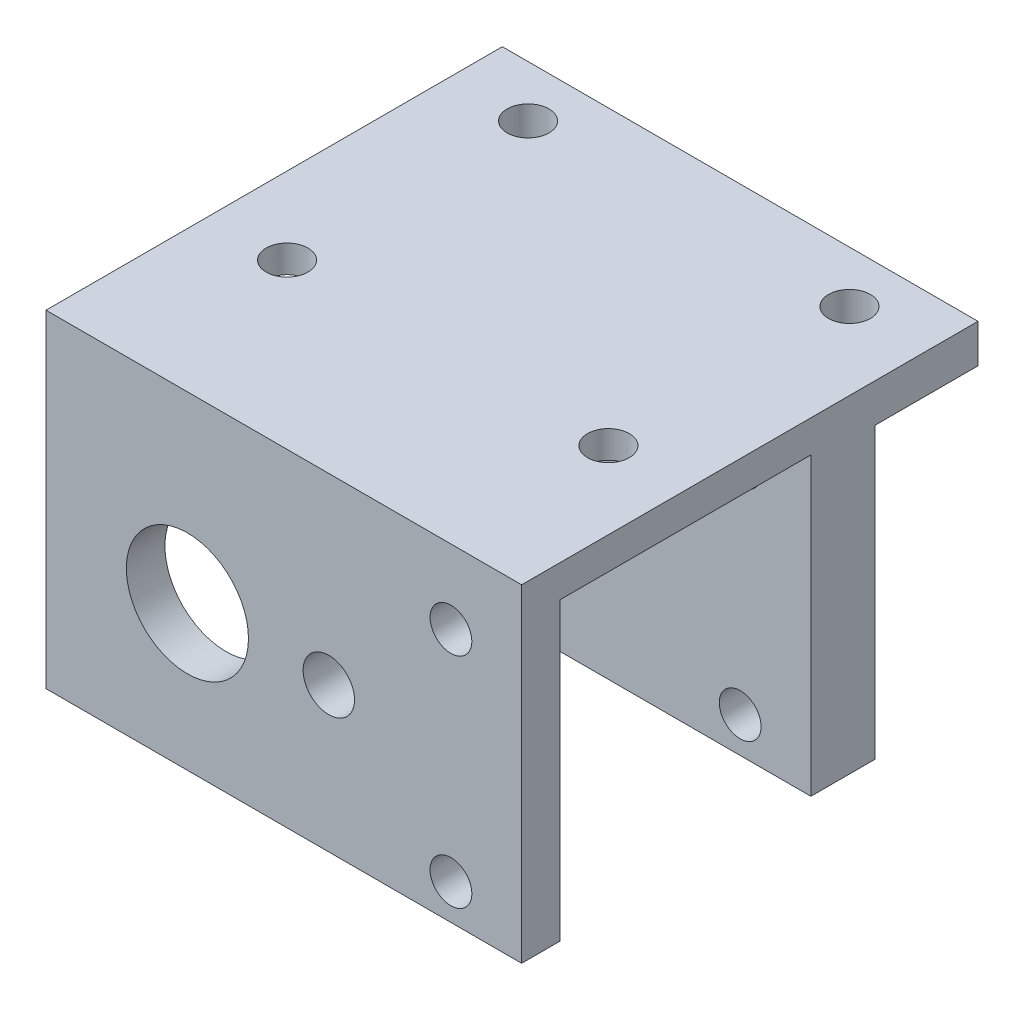
ISO-10303-21;
HEADER;
FILE_DESCRIPTION(('STEP AP214'),'2;1');
FILE_NAME('part.step','',(''),(''),'','','');
FILE_SCHEMA(('AUTOMOTIVE_DESIGN { 1 0 10303 214 1 1 1 1 }'));
ENDSEC;
DATA;
#1=APPLICATION_CONTEXT('core data for automotive mechanical design processes');
#2=APPLICATION_PROTOCOL_DEFINITION('international standard','automotive_design',2000,#1);
#3=PRODUCT_CONTEXT('',#1,'mechanical');
#4=PRODUCT('Part','Part','',(#3));
#5=PRODUCT_RELATED_PRODUCT_CATEGORY('part','',(#4));
#6=PRODUCT_DEFINITION_FORMATION('','',#4);
#7=PRODUCT_DEFINITION_CONTEXT('part definition',#1,'design');
#8=PRODUCT_DEFINITION('design','',#6,#7);
#9=PRODUCT_DEFINITION_SHAPE('','',#8);
#10=(LENGTH_UNIT() NAMED_UNIT(*) SI_UNIT(.MILLI.,.METRE.));
#11=(NAMED_UNIT(*) PLANE_ANGLE_UNIT() SI_UNIT($,.RADIAN.));
#12=(NAMED_UNIT(*) SI_UNIT($,.STERADIAN.) SOLID_ANGLE_UNIT());
#13=UNCERTAINTY_MEASURE_WITH_UNIT(LENGTH_MEASURE(1.E-05),#10,'distance_accuracy_value','');
#14=(GEOMETRIC_REPRESENTATION_CONTEXT(3) GLOBAL_UNCERTAINTY_ASSIGNED_CONTEXT((#13)) GLOBAL_UNIT_ASSIGNED_CONTEXT((#10,
#11,#12)) REPRESENTATION_CONTEXT('',''));
#15=CARTESIAN_POINT('',(0.,0.,0.));
#16=DIRECTION('',(0.,0.,1.));
#17=DIRECTION('',(1.,0.,0.));
#18=AXIS2_PLACEMENT_3D('',#15,#16,#17);
#19=CARTESIAN_POINT('',(6.,22.5,-9.75));
#20=DIRECTION('',(0.,-1.,0.));
#21=DIRECTION('',(0.,0.,-1.));
#22=AXIS2_PLACEMENT_3D('',#19,#20,#21);
#23=CONICAL_SURFACE('',#22,3.12500000000001,1.04719755119659);
#24=CARTESIAN_POINT('',(6.,23.3660254037845,-9.75));
#25=DIRECTION('',(0.,-1.,0.));
#26=DIRECTION('',(0.,0.,-1.));
#27=AXIS2_PLACEMENT_3D('',#24,#25,#26);
#28=CIRCLE('',#27,1.625);
#29=CARTESIAN_POINT('',(6.,23.3660254037845,-11.375));
#30=VERTEX_POINT('',#29);
#31=EDGE_CURVE('E364',#30,#30,#28,.T.);
#32=ORIENTED_EDGE('',*,*,#31,.F.);
#33=EDGE_LOOP('',(#32));
#34=FACE_BOUND('',#33,.T.);
#35=CARTESIAN_POINT('',(6.,23.,-9.75));
#36=DIRECTION('',(0.,-1.,0.));
#37=DIRECTION('',(0.,0.,-1.));
#38=AXIS2_PLACEMENT_3D('',#35,#36,#37);
#39=CIRCLE('',#38,2.25897459621558);
#40=CARTESIAN_POINT('',(6.,23.,-12.0089745962156));
#41=VERTEX_POINT('',#40);
#42=EDGE_CURVE('E186',#41,#41,#39,.T.);
#43=ORIENTED_EDGE('',*,*,#42,.T.);
#44=EDGE_LOOP('',(#43));
#45=FACE_BOUND('',#44,.T.);
#46=ADVANCED_FACE('F48',(#34,#45),#23,.F.);
#47=CARTESIAN_POINT('',(31.,22.5,-9.75));
#48=DIRECTION('',(0.,-1.,0.));
#49=DIRECTION('',(0.,0.,-1.));
#50=AXIS2_PLACEMENT_3D('',#47,#48,#49);
#51=CONICAL_SURFACE('',#50,3.12500000000001,1.04719755119659);
#52=CARTESIAN_POINT('',(31.,23.3660254037845,-9.75));
#53=DIRECTION('',(0.,-1.,0.));
#54=DIRECTION('',(0.,0.,-1.));
#55=AXIS2_PLACEMENT_3D('',#52,#53,#54);
#56=CIRCLE('',#55,1.625);
#57=CARTESIAN_POINT('',(31.,23.3660254037845,-11.375));
#58=VERTEX_POINT('',#57);
#59=EDGE_CURVE('E368',#58,#58,#56,.T.);
#60=ORIENTED_EDGE('',*,*,#59,.F.);
#61=EDGE_LOOP('',(#60));
#62=FACE_BOUND('',#61,.T.);
#63=CARTESIAN_POINT('',(31.,23.,-9.75));
#64=DIRECTION('',(0.,-1.,0.));
#65=DIRECTION('',(0.,0.,-1.));
#66=AXIS2_PLACEMENT_3D('',#63,#64,#65);
#67=CIRCLE('',#66,2.25897459621559);
#68=CARTESIAN_POINT('',(31.,23.,-12.0089745962156));
#69=VERTEX_POINT('',#68);
#70=EDGE_CURVE('E53',#69,#69,#67,.T.);
#71=ORIENTED_EDGE('',*,*,#70,.T.);
#72=EDGE_LOOP('',(#71));
#73=FACE_BOUND('',#72,.T.);
#74=ADVANCED_FACE('F491',(#62,#73),#51,.F.);
#75=CARTESIAN_POINT('',(0.,8.05695288465185,-34.5));
#76=DIRECTION('',(-1.,0.,0.));
#77=DIRECTION('',(0.,0.,1.));
#78=AXIS2_PLACEMENT_3D('',#75,#76,#77);
#79=CYLINDRICAL_SURFACE('',#78,10.);
#80=CARTESIAN_POINT('',(8.76214062711407,13.8521907482519,-26.3504467543125));
#81=CARTESIAN_POINT('',(8.71825841442849,13.7729155747595,-26.2940710339034));
#82=CARTESIAN_POINT('',(8.67283991834139,13.6933832669195,-26.2392586288882));
#83=CARTESIAN_POINT('',(8.57898228015429,13.5340138205835,-26.1327435744473));
#84=CARTESIAN_POINT('',(8.53054303669502,13.4541766719433,-26.0810410294855));
#85=CARTESIAN_POINT('',(8.43043985143701,13.2939980155577,-25.980472472779));
#86=CARTESIAN_POINT('',(8.37876048743787,13.2136560395924,-25.9316225638822));
#87=CARTESIAN_POINT('',(8.27238348974335,13.0531367311736,-25.8370430264732));
#88=CARTESIAN_POINT('',(8.21768592865551,12.9729593948076,-25.7913133229587));
#89=CARTESIAN_POINT('',(8.10248527029677,12.8092499555203,-25.7008620042878));
#90=CARTESIAN_POINT('',(8.04182964832571,12.7257406516306,-25.6562930164816));
#91=CARTESIAN_POINT('',(7.91686918309533,12.5596892526119,-25.5706052551965));
#92=CARTESIAN_POINT('',(7.85256456039213,12.4771470993886,-25.5294862735609));
#93=CARTESIAN_POINT('',(7.7200552225245,12.3138324787121,-25.4508469658512));
#94=CARTESIAN_POINT('',(7.651859610447,12.2330564465557,-25.4133187490629));
#95=CARTESIAN_POINT('',(7.51083947548826,12.0740071693088,-25.341896666362));
#96=CARTESIAN_POINT('',(7.43801719897952,11.9957327369542,-25.3080010578754));
#97=CARTESIAN_POINT('',(7.31516488785172,11.8717626148251,-25.2560882370319));
#98=CARTESIAN_POINT('',(7.26684336469774,11.8248695323286,-25.2368876876986));
#99=CARTESIAN_POINT('',(7.16766790035096,11.7331282002895,-25.2000981479607));
#100=CARTESIAN_POINT('',(7.11681332912195,11.6882804648462,-25.1825095616148));
#101=CARTESIAN_POINT('',(7.01253228687096,11.6016632175618,-25.1492157463441));
#102=CARTESIAN_POINT('',(6.95912476699458,11.5598755263927,-25.1334989751419));
#103=CARTESIAN_POINT('',(6.84902769127506,11.480131105798,-25.1040617681444));
#104=CARTESIAN_POINT('',(6.79234054994906,11.4421716130693,-25.0903398891734));
#105=CARTESIAN_POINT('',(6.67020223932992,11.3685091624178,-25.0641509876081));
#106=CARTESIAN_POINT('',(6.60441609835915,11.3332762120207,-25.0518913928578));
#107=CARTESIAN_POINT('',(6.46824326386113,11.2717595717825,-25.0307823925141));
#108=CARTESIAN_POINT('',(6.39786414058892,11.2454615781037,-25.0219275333087));
#109=CARTESIAN_POINT('',(6.26419181494041,11.2080876456763,-25.0094423485665));
#110=CARTESIAN_POINT('',(6.20144333098222,11.195307701036,-25.00522323262));
#111=CARTESIAN_POINT('',(6.0745590252176,11.1801328399804,-25.000220118374));
#112=CARTESIAN_POINT('',(6.01042425628274,11.1777303025182,-24.9994335992111));
#113=CARTESIAN_POINT('',(5.88273698861787,11.1836536309187,-25.0013817711819));
#114=CARTESIAN_POINT('',(5.81918440097667,11.1919778301186,-25.0041159152937));
#115=CARTESIAN_POINT('',(5.69433639580003,11.2181855026642,-25.0128089733311));
#116=CARTESIAN_POINT('',(5.63304315286806,11.2360779411545,-25.0187709116653));
#117=CARTESIAN_POINT('',(5.48146549782995,11.2911680049304,-25.0373857012556));
#118=CARTESIAN_POINT('',(5.39333900358509,11.3335729794334,-25.0519127214651));
#119=CARTESIAN_POINT('',(5.22459980884716,11.4299256894153,-25.085878649497));
#120=CARTESIAN_POINT('',(5.14401947065518,11.4839201384175,-25.1053374951125));
#121=CARTESIAN_POINT('',(4.96701784147735,11.6156477013098,-25.1543095328825));
#122=CARTESIAN_POINT('',(4.87273686620368,11.6957344817717,-25.1851036644865));
#123=CARTESIAN_POINT('',(4.69231022380309,11.8626718284423,-25.2520460181625));
#124=CARTESIAN_POINT('',(4.60618046608102,11.9495350418548,-25.2882043708608));
#125=CARTESIAN_POINT('',(4.4400174929785,12.1277014095245,-25.3655326641716));
#126=CARTESIAN_POINT('',(4.36001936891353,12.2190258360071,-25.4067283881396));
#127=CARTESIAN_POINT('',(4.20550445585767,12.4040923381301,-25.4937328261162));
#128=CARTESIAN_POINT('',(4.1309891295113,12.4978350499525,-25.5395427633918));
#129=CARTESIAN_POINT('',(3.97893065393652,12.6969930432741,-25.6408898235277));
#130=CARTESIAN_POINT('',(3.90194127392688,12.8025678814488,-25.6969429708951));
#131=CARTESIAN_POINT('',(3.7533881281875,13.0145185052547,-25.814538340763));
#132=CARTESIAN_POINT('',(3.68182592949236,13.1208945125412,-25.8760821375445));
#133=CARTESIAN_POINT('',(3.54526787799961,13.331724427442,-26.0034325964813));
#134=CARTESIAN_POINT('',(3.48017325261684,13.4361765378704,-26.069136310914));
#135=CARTESIAN_POINT('',(3.35514124311078,13.6446323394352,-26.2058215009225));
#136=CARTESIAN_POINT('',(3.29520166165299,13.7486362034988,-26.2768007035319));
#137=CARTESIAN_POINT('',(3.23785937288593,13.8521907482519,-26.3504467543125));
#138=B_SPLINE_CURVE_WITH_KNOTS('',3,(#80,#81,#82,#83,#84,#85,#86,#87,#88,#89,#90,#91,#92,#93,
#94,#95,#96,#97,#98,#99,#100,#101,#102,#103,#104,#105,#106,#107,#108,#109,#110,#111,#112,#113,
#114,#115,#116,#117,#118,#119,#120,#121,#122,#123,#124,#125,#126,#127,#128,#129,#130,#131,#132,
#133,#134,#135,#136,#137),.UNSPECIFIED.,.F.,.F.,(4,2,2,2,2,2,2,2,2,2,2,2,2,2,2,2,2,2,2,2,2,2,2,
2,2,2,2,2,4),(0.,0.320122229611593,0.640255206506819,0.962048589253313,1.2838342341189,
1.62099858115555,1.95814257066977,2.29452779816172,2.63075093139546,2.84073240744319,
3.05076637482444,3.25942958921633,3.46794108995105,3.69427032058995,3.92023549785851,
4.11192135234669,4.30346641101756,4.4949817120335,4.68667677218752,4.98157740453194,
5.27768979092476,5.65926486103875,6.04156995309525,6.42592089842727,6.81037400798576,
7.23668841772162,7.66312545573429,8.08147725186307,8.49964983272973),.UNSPECIFIED.);
#139=CARTESIAN_POINT('',(8.76214062711407,13.8521907482519,-26.3504467543125));
#140=VERTEX_POINT('',#139);
#141=CARTESIAN_POINT('',(3.23785937288593,13.8521907482519,-26.3504467543125));
#142=VERTEX_POINT('',#141);
#143=EDGE_CURVE('E12',#140,#142,#138,.T.);
#144=ORIENTED_EDGE('',*,*,#143,.F.);
#145=DIRECTION('',(1.,0.,0.));
#146=VECTOR('',#145,1.);
#147=CARTESIAN_POINT('',(0.,13.8521907482519,-26.3504467543125));
#148=LINE('',#147,#146);
#149=CARTESIAN_POINT('',(27.,13.8521907482519,-26.3504467543125));
#150=VERTEX_POINT('',#149);
#151=EDGE_CURVE('E376',#150,#140,#148,.F.);
#152=ORIENTED_EDGE('',*,*,#151,.F.);
#153=CARTESIAN_POINT('',(27.,8.05695288465185,-34.5));
#154=DIRECTION('',(1.,0.,0.));
#155=DIRECTION('',(0.,0.,-1.));
#156=AXIS2_PLACEMENT_3D('',#153,#154,#155);
#157=CIRCLE('',#156,10.);
#158=CARTESIAN_POINT('',(27.,8.05695288465185,-24.5));
#159=VERTEX_POINT('',#158);
#160=EDGE_CURVE('E380',#159,#150,#157,.F.);
#161=ORIENTED_EDGE('',*,*,#160,.F.);
#162=DIRECTION('',(1.,0.,0.));
#163=VECTOR('',#162,1.);
#164=CARTESIAN_POINT('',(27.,8.05695288465185,-24.5));
#165=LINE('',#164,#163);
#166=CARTESIAN_POINT('',(0.,8.05695288465185,-24.5));
#167=VERTEX_POINT('',#166);
#168=EDGE_CURVE('E372',#167,#159,#165,.T.);
#169=ORIENTED_EDGE('',*,*,#168,.F.);
#170=CARTESIAN_POINT('',(0.,8.05695288465185,-34.5));
#171=DIRECTION('',(1.,0.,0.));
#172=DIRECTION('',(0.,0.,-1.));
#173=AXIS2_PLACEMENT_3D('',#170,#171,#172);
#174=CIRCLE('',#173,10.);
#175=CARTESIAN_POINT('',(0.,13.8521907482519,-26.3504467543125));
#176=VERTEX_POINT('',#175);
#177=EDGE_CURVE('E59',#176,#167,#174,.T.);
#178=ORIENTED_EDGE('',*,*,#177,.F.);
#179=EDGE_CURVE('E72',#142,#176,#148,.F.);
#180=ORIENTED_EDGE('',*,*,#179,.F.);
#181=EDGE_LOOP('',(#144,#152,#161,#169,#178,#180));
#182=FACE_BOUND('',#181,.T.);
#183=ADVANCED_FACE('F50',(#182),#79,.F.);
#184=CARTESIAN_POINT('',(-13.8044376922785,22.5,-32.5));
#185=DIRECTION('',(0.,-0.579523786360004,-0.814955324568755));
#186=DIRECTION('',(0.,0.814955324568755,-0.579523786360004));
#187=AXIS2_PLACEMENT_3D('',#184,#185,#186);
#188=PLANE('',#187);
#189=ORIENTED_EDGE('',*,*,#151,.T.);
#190=CARTESIAN_POINT('',(6.,16.875,-28.5));
#191=DIRECTION('',(0.,-0.579523786360004,-0.814955324568755));
#192=DIRECTION('',(0.,-0.814955324568755,0.579523786360004));
#193=AXIS2_PLACEMENT_3D('',#190,#191,#192);
#194=ELLIPSE('',#193,6.03944149037185,3.5);
#195=EDGE_CURVE('E65',#140,#142,#194,.F.);
#196=ORIENTED_EDGE('',*,*,#195,.T.);
#197=ORIENTED_EDGE('',*,*,#179,.T.);
#198=DIRECTION('',(0.,-0.814955324568755,0.579523786360004));
#199=VECTOR('',#198,1.);
#200=CARTESIAN_POINT('',(0.,22.5,-32.5));
#201=LINE('',#200,#199);
#202=CARTESIAN_POINT('',(0.,22.5,-32.5));
#203=VERTEX_POINT('',#202);
#204=EDGE_CURVE('E239',#203,#176,#201,.T.);
#205=ORIENTED_EDGE('',*,*,#204,.F.);
#206=DIRECTION('',(1.,0.,0.));
#207=VECTOR('',#206,1.);
#208=CARTESIAN_POINT('',(0.,22.5,-32.5));
#209=LINE('',#208,#207);
#210=CARTESIAN_POINT('',(27.,22.5,-32.5));
#211=VERTEX_POINT('',#210);
#212=EDGE_CURVE('E284',#203,#211,#209,.T.);
#213=ORIENTED_EDGE('',*,*,#212,.T.);
#214=DIRECTION('',(0.,0.814955324568755,-0.579523786360004));
#215=VECTOR('',#214,1.);
#216=CARTESIAN_POINT('',(27.,22.5,-32.5));
#217=LINE('',#216,#215);
#218=EDGE_CURVE('E225',#150,#211,#217,.T.);
#219=ORIENTED_EDGE('',*,*,#218,.F.);
#220=EDGE_LOOP('',(#189,#196,#197,#205,#213,#219));
#221=FACE_BOUND('',#220,.T.);
#222=ADVANCED_FACE('F423',(#221),#188,.T.);
#223=CARTESIAN_POINT('',(0.,0.,3.));
#224=DIRECTION('',(0.,0.,-1.));
#225=DIRECTION('',(-1.,0.,0.));
#226=AXIS2_PLACEMENT_3D('',#223,#224,#225);
#227=PLANE('',#226);
#228=DIRECTION('',(0.,-1.,0.));
#229=VECTOR('',#228,1.);
#230=CARTESIAN_POINT('',(0.,0.,3.));
#231=LINE('',#230,#229);
#232=CARTESIAN_POINT('',(0.,25.5,3.));
#233=VERTEX_POINT('',#232);
#234=CARTESIAN_POINT('',(0.,0.,3.));
#235=VERTEX_POINT('',#234);
#236=EDGE_CURVE('E342',#233,#235,#231,.T.);
#237=ORIENTED_EDGE('',*,*,#236,.T.);
#238=DIRECTION('',(1.,0.,0.));
#239=VECTOR('',#238,1.);
#240=CARTESIAN_POINT('',(0.,0.,3.));
#241=LINE('',#240,#239);
#242=CARTESIAN_POINT('',(37.,0.,3.));
#243=VERTEX_POINT('',#242);
#244=EDGE_CURVE('E346',#235,#243,#241,.T.);
#245=ORIENTED_EDGE('',*,*,#244,.T.);
#246=DIRECTION('',(0.,1.,0.));
#247=VECTOR('',#246,1.);
#248=CARTESIAN_POINT('',(37.,0.,3.));
#249=LINE('',#248,#247);
#250=CARTESIAN_POINT('',(37.,25.5,3.));
#251=VERTEX_POINT('',#250);
#252=EDGE_CURVE('E350',#243,#251,#249,.T.);
#253=ORIENTED_EDGE('',*,*,#252,.T.);
#254=DIRECTION('',(-1.,0.,0.));
#255=VECTOR('',#254,1.);
#256=CARTESIAN_POINT('',(0.,25.5,3.));
#257=LINE('',#256,#255);
#258=EDGE_CURVE('E297',#251,#233,#257,.T.);
#259=ORIENTED_EDGE('',*,*,#258,.T.);
#260=EDGE_LOOP('',(#237,#245,#253,#259));
#261=FACE_BOUND('',#260,.T.);
#262=CARTESIAN_POINT('',(31.5,19.75,3.));
#263=DIRECTION('',(0.,0.,1.));
#264=DIRECTION('',(1.,0.,0.));
#265=AXIS2_PLACEMENT_3D('',#262,#263,#264);
#266=CIRCLE('',#265,1.625);
#267=CARTESIAN_POINT('',(33.125,19.75,3.));
#268=VERTEX_POINT('',#267);
#269=EDGE_CURVE('E163',#268,#268,#266,.T.);
#270=ORIENTED_EDGE('',*,*,#269,.F.);
#271=EDGE_LOOP('',(#270));
#272=FACE_BOUND('',#271,.T.);
#273=CARTESIAN_POINT('',(31.5,2.74999999999999,3.));
#274=DIRECTION('',(0.,0.,1.));
#275=DIRECTION('',(-1.,0.,0.));
#276=AXIS2_PLACEMENT_3D('',#273,#274,#275);
#277=CIRCLE('',#276,1.625);
#278=CARTESIAN_POINT('',(29.875,2.74999999999999,3.));
#279=VERTEX_POINT('',#278);
#280=EDGE_CURVE('E328',#279,#279,#277,.T.);
#281=ORIENTED_EDGE('',*,*,#280,.F.);
#282=EDGE_LOOP('',(#281));
#283=FACE_BOUND('',#282,.T.);
#284=CARTESIAN_POINT('',(22.,11.25,3.));
#285=DIRECTION('',(0.,0.,1.));
#286=DIRECTION('',(1.,0.,0.));
#287=AXIS2_PLACEMENT_3D('',#284,#285,#286);
#288=CIRCLE('',#287,2.);
#289=CARTESIAN_POINT('',(24.,11.25,3.));
#290=VERTEX_POINT('',#289);
#291=EDGE_CURVE('E320',#290,#290,#288,.T.);
#292=ORIENTED_EDGE('',*,*,#291,.F.);
#293=EDGE_LOOP('',(#292));
#294=FACE_BOUND('',#293,.T.);
#295=CARTESIAN_POINT('',(11.,11.25,3.));
#296=DIRECTION('',(0.,0.,1.));
#297=DIRECTION('',(1.,0.,0.));
#298=AXIS2_PLACEMENT_3D('',#295,#296,#297);
#299=CIRCLE('',#298,4.75);
#300=CARTESIAN_POINT('',(15.75,11.25,3.));
#301=VERTEX_POINT('',#300);
#302=EDGE_CURVE('E312',#301,#301,#299,.T.);
#303=ORIENTED_EDGE('',*,*,#302,.F.);
#304=EDGE_LOOP('',(#303));
#305=FACE_BOUND('',#304,.T.);
#306=ADVANCED_FACE('F426',(#261,#272,#283,#294,#305),#227,.F.);
#307=CARTESIAN_POINT('',(0.,0.,0.));
#308=DIRECTION('',(0.,0.,-1.));
#309=DIRECTION('',(-1.,0.,0.));
#310=AXIS2_PLACEMENT_3D('',#307,#308,#309);
#311=PLANE('',#310);
#312=CARTESIAN_POINT('',(22.,11.25,0.));
#313=DIRECTION('',(0.,0.,1.));
#314=DIRECTION('',(1.,0.,0.));
#315=AXIS2_PLACEMENT_3D('',#312,#313,#314);
#316=CIRCLE('',#315,2.);
#317=CARTESIAN_POINT('',(24.,11.25,0.));
#318=VERTEX_POINT('',#317);
#319=EDGE_CURVE('E316',#318,#318,#316,.T.);
#320=ORIENTED_EDGE('',*,*,#319,.T.);
#321=EDGE_LOOP('',(#320));
#322=FACE_BOUND('',#321,.T.);
#323=CARTESIAN_POINT('',(31.5,19.75,0.));
#324=DIRECTION('',(0.,0.,1.));
#325=DIRECTION('',(1.,0.,0.));
#326=AXIS2_PLACEMENT_3D('',#323,#324,#325);
#327=CIRCLE('',#326,1.625);
#328=CARTESIAN_POINT('',(33.125,19.75,0.));
#329=VERTEX_POINT('',#328);
#330=EDGE_CURVE('E332',#329,#329,#327,.T.);
#331=ORIENTED_EDGE('',*,*,#330,.T.);
#332=EDGE_LOOP('',(#331));
#333=FACE_BOUND('',#332,.T.);
#334=DIRECTION('',(0.,-1.,0.));
#335=VECTOR('',#334,1.);
#336=CARTESIAN_POINT('',(0.,0.,0.));
#337=LINE('',#336,#335);
#338=CARTESIAN_POINT('',(0.,23.,0.));
#339=VERTEX_POINT('',#338);
#340=CARTESIAN_POINT('',(0.,0.,0.));
#341=VERTEX_POINT('',#340);
#342=EDGE_CURVE('E150',#339,#341,#337,.T.);
#343=ORIENTED_EDGE('',*,*,#342,.F.);
#344=DIRECTION('',(-1.,0.,0.));
#345=VECTOR('',#344,1.);
#346=CARTESIAN_POINT('',(37.,23.,0.));
#347=LINE('',#346,#345);
#348=CARTESIAN_POINT('',(37.,23.,0.));
#349=VERTEX_POINT('',#348);
#350=EDGE_CURVE('E155',#349,#339,#347,.T.);
#351=ORIENTED_EDGE('',*,*,#350,.F.);
#352=DIRECTION('',(0.,1.,0.));
#353=VECTOR('',#352,1.);
#354=CARTESIAN_POINT('',(37.,0.,0.));
#355=LINE('',#354,#353);
#356=CARTESIAN_POINT('',(37.,0.,0.));
#357=VERTEX_POINT('',#356);
#358=EDGE_CURVE('E347',#357,#349,#355,.T.);
#359=ORIENTED_EDGE('',*,*,#358,.F.);
#360=DIRECTION('',(1.,0.,0.));
#361=VECTOR('',#360,1.);
#362=CARTESIAN_POINT('',(0.,0.,0.));
#363=LINE('',#362,#361);
#364=EDGE_CURVE('E157',#341,#357,#363,.T.);
#365=ORIENTED_EDGE('',*,*,#364,.F.);
#366=EDGE_LOOP('',(#343,#351,#359,#365));
#367=FACE_BOUND('',#366,.T.);
#368=CARTESIAN_POINT('',(31.5,2.74999999999999,0.));
#369=DIRECTION('',(0.,0.,1.));
#370=DIRECTION('',(-1.,0.,0.));
#371=AXIS2_PLACEMENT_3D('',#368,#369,#370);
#372=CIRCLE('',#371,1.625);
#373=CARTESIAN_POINT('',(29.875,2.74999999999999,0.));
#374=VERTEX_POINT('',#373);
#375=EDGE_CURVE('E324',#374,#374,#372,.T.);
#376=ORIENTED_EDGE('',*,*,#375,.T.);
#377=EDGE_LOOP('',(#376));
#378=FACE_BOUND('',#377,.T.);
#379=CARTESIAN_POINT('',(11.,11.25,0.));
#380=DIRECTION('',(0.,0.,1.));
#381=DIRECTION('',(1.,0.,0.));
#382=AXIS2_PLACEMENT_3D('',#379,#380,#381);
#383=CIRCLE('',#382,4.75);
#384=CARTESIAN_POINT('',(15.75,11.25,0.));
#385=VERTEX_POINT('',#384);
#386=EDGE_CURVE('E309',#385,#385,#383,.T.);
#387=ORIENTED_EDGE('',*,*,#386,.T.);
#388=EDGE_LOOP('',(#387));
#389=FACE_BOUND('',#388,.T.);
#390=ADVANCED_FACE('F152',(#322,#333,#367,#378,#389),#311,.T.);
#391=CARTESIAN_POINT('',(0.,0.,3.));
#392=DIRECTION('',(1.,0.,0.));
#393=DIRECTION('',(0.,0.,-1.));
#394=AXIS2_PLACEMENT_3D('',#391,#392,#393);
#395=PLANE('',#394);
#396=DIRECTION('',(0.,0.,-1.));
#397=VECTOR('',#396,1.);
#398=CARTESIAN_POINT('',(0.,23.,0.));
#399=LINE('',#398,#397);
#400=CARTESIAN_POINT('',(0.,23.,-19.5));
#401=VERTEX_POINT('',#400);
#402=EDGE_CURVE('E169',#339,#401,#399,.T.);
#403=ORIENTED_EDGE('',*,*,#402,.F.);
#404=ORIENTED_EDGE('',*,*,#342,.T.);
#405=DIRECTION('',(0.,0.,-1.));
#406=VECTOR('',#405,1.);
#407=CARTESIAN_POINT('',(0.,0.,3.));
#408=LINE('',#407,#406);
#409=EDGE_CURVE('E361',#235,#341,#408,.T.);
#410=ORIENTED_EDGE('',*,*,#409,.F.);
#411=ORIENTED_EDGE('',*,*,#236,.F.);
#412=DIRECTION('',(0.,0.,-1.));
#413=VECTOR('',#412,1.);
#414=CARTESIAN_POINT('',(0.,25.5,3.));
#415=LINE('',#414,#413);
#416=CARTESIAN_POINT('',(0.,25.5,-32.5));
#417=VERTEX_POINT('',#416);
#418=EDGE_CURVE('E285',#233,#417,#415,.T.);
#419=ORIENTED_EDGE('',*,*,#418,.T.);
#420=DIRECTION('',(0.,-1.,0.));
#421=VECTOR('',#420,1.);
#422=CARTESIAN_POINT('',(0.,25.5,-32.5));
#423=LINE('',#422,#421);
#424=EDGE_CURVE('E301',#417,#203,#423,.T.);
#425=ORIENTED_EDGE('',*,*,#424,.T.);
#426=ORIENTED_EDGE('',*,*,#204,.T.);
#427=ORIENTED_EDGE('',*,*,#177,.T.);
#428=DIRECTION('',(0.,1.,0.));
#429=VECTOR('',#428,1.);
#430=CARTESIAN_POINT('',(0.,0.,-24.5));
#431=LINE('',#430,#429);
#432=CARTESIAN_POINT('',(0.,0.,-24.5));
#433=VERTEX_POINT('',#432);
#434=EDGE_CURVE('E262',#433,#167,#431,.T.);
#435=ORIENTED_EDGE('',*,*,#434,.F.);
#436=DIRECTION('',(0.,0.,1.));
#437=VECTOR('',#436,1.);
#438=CARTESIAN_POINT('',(0.,0.,-24.5));
#439=LINE('',#438,#437);
#440=CARTESIAN_POINT('',(0.,0.,-19.5));
#441=VERTEX_POINT('',#440);
#442=EDGE_CURVE('E281',#433,#441,#439,.T.);
#443=ORIENTED_EDGE('',*,*,#442,.T.);
#444=DIRECTION('',(0.,1.,0.));
#445=VECTOR('',#444,1.);
#446=CARTESIAN_POINT('',(0.,0.,-19.5));
#447=LINE('',#446,#445);
#448=EDGE_CURVE('E176',#441,#401,#447,.T.);
#449=ORIENTED_EDGE('',*,*,#448,.T.);
#450=EDGE_LOOP('',(#403,#404,#410,#411,#419,#425,#426,#427,#435,#443,#449));
#451=FACE_BOUND('',#450,.T.);
#452=ADVANCED_FACE('F174',(#451),#395,.F.);
#453=CARTESIAN_POINT('',(0.,0.,3.));
#454=DIRECTION('',(0.,1.,0.));
#455=DIRECTION('',(0.,0.,1.));
#456=AXIS2_PLACEMENT_3D('',#453,#454,#455);
#457=PLANE('',#456);
#458=ORIENTED_EDGE('',*,*,#364,.T.);
#459=DIRECTION('',(0.,0.,-1.));
#460=VECTOR('',#459,1.);
#461=CARTESIAN_POINT('',(37.,0.,3.));
#462=LINE('',#461,#460);
#463=EDGE_CURVE('E352',#243,#357,#462,.T.);
#464=ORIENTED_EDGE('',*,*,#463,.F.);
#465=ORIENTED_EDGE('',*,*,#244,.F.);
#466=ORIENTED_EDGE('',*,*,#409,.T.);
#467=EDGE_LOOP('',(#458,#464,#465,#466));
#468=FACE_BOUND('',#467,.T.);
#469=ADVANCED_FACE('F479',(#468),#457,.F.);
#470=CARTESIAN_POINT('',(37.,0.,3.));
#471=DIRECTION('',(-1.,0.,0.));
#472=DIRECTION('',(0.,0.,1.));
#473=AXIS2_PLACEMENT_3D('',#470,#471,#472);
#474=PLANE('',#473);
#475=ORIENTED_EDGE('',*,*,#358,.T.);
#476=DIRECTION('',(0.,0.,1.));
#477=VECTOR('',#476,1.);
#478=CARTESIAN_POINT('',(37.,23.,-19.5));
#479=LINE('',#478,#477);
#480=CARTESIAN_POINT('',(37.,23.,-19.5));
#481=VERTEX_POINT('',#480);
#482=EDGE_CURVE('E171',#481,#349,#479,.T.);
#483=ORIENTED_EDGE('',*,*,#482,.F.);
#484=DIRECTION('',(0.,-1.,0.));
#485=VECTOR('',#484,1.);
#486=CARTESIAN_POINT('',(37.,22.5,-19.5));
#487=LINE('',#486,#485);
#488=CARTESIAN_POINT('',(37.,0.,-19.5));
#489=VERTEX_POINT('',#488);
#490=EDGE_CURVE('E263',#481,#489,#487,.T.);
#491=ORIENTED_EDGE('',*,*,#490,.T.);
#492=DIRECTION('',(0.,0.,1.));
#493=VECTOR('',#492,1.);
#494=CARTESIAN_POINT('',(37.,0.,-24.5));
#495=LINE('',#494,#493);
#496=CARTESIAN_POINT('',(37.,0.,-24.5));
#497=VERTEX_POINT('',#496);
#498=EDGE_CURVE('E270',#497,#489,#495,.T.);
#499=ORIENTED_EDGE('',*,*,#498,.F.);
#500=DIRECTION('',(0.,-1.,0.));
#501=VECTOR('',#500,1.);
#502=CARTESIAN_POINT('',(37.,22.5,-24.5));
#503=LINE('',#502,#501);
#504=CARTESIAN_POINT('',(37.,22.5,-24.5));
#505=VERTEX_POINT('',#504);
#506=EDGE_CURVE('E267',#505,#497,#503,.T.);
#507=ORIENTED_EDGE('',*,*,#506,.F.);
#508=DIRECTION('',(0.,0.,1.));
#509=VECTOR('',#508,1.);
#510=CARTESIAN_POINT('',(37.,22.5,-24.5));
#511=LINE('',#510,#509);
#512=CARTESIAN_POINT('',(37.,22.5,-32.5));
#513=VERTEX_POINT('',#512);
#514=EDGE_CURVE('E217',#513,#505,#511,.T.);
#515=ORIENTED_EDGE('',*,*,#514,.F.);
#516=DIRECTION('',(0.,-1.,0.));
#517=VECTOR('',#516,1.);
#518=CARTESIAN_POINT('',(37.,25.5,-32.5));
#519=LINE('',#518,#517);
#520=CARTESIAN_POINT('',(37.,25.5,-32.5));
#521=VERTEX_POINT('',#520);
#522=EDGE_CURVE('E305',#521,#513,#519,.T.);
#523=ORIENTED_EDGE('',*,*,#522,.F.);
#524=DIRECTION('',(0.,0.,1.));
#525=VECTOR('',#524,1.);
#526=CARTESIAN_POINT('',(37.,25.5,3.));
#527=LINE('',#526,#525);
#528=EDGE_CURVE('E293',#521,#251,#527,.T.);
#529=ORIENTED_EDGE('',*,*,#528,.T.);
#530=ORIENTED_EDGE('',*,*,#252,.F.);
#531=ORIENTED_EDGE('',*,*,#463,.T.);
#532=EDGE_LOOP('',(#475,#483,#491,#499,#507,#515,#523,#529,#530,#531));
#533=FACE_BOUND('',#532,.T.);
#534=ADVANCED_FACE('F469',(#533),#474,.F.);
#535=CARTESIAN_POINT('',(31.5,19.75,3.));
#536=DIRECTION('',(0.,0.,-1.));
#537=DIRECTION('',(-1.,0.,0.));
#538=AXIS2_PLACEMENT_3D('',#535,#536,#537);
#539=CYLINDRICAL_SURFACE('',#538,1.625);
#540=ORIENTED_EDGE('',*,*,#269,.T.);
#541=EDGE_LOOP('',(#540));
#542=FACE_BOUND('',#541,.T.);
#543=ORIENTED_EDGE('',*,*,#330,.F.);
#544=EDGE_LOOP('',(#543));
#545=FACE_BOUND('',#544,.T.);
#546=ADVANCED_FACE('F465',(#542,#545),#539,.F.);
#547=CARTESIAN_POINT('',(31.5,2.74999999999999,3.));
#548=DIRECTION('',(0.,0.,-1.));
#549=DIRECTION('',(-1.,0.,0.));
#550=AXIS2_PLACEMENT_3D('',#547,#548,#549);
#551=CYLINDRICAL_SURFACE('',#550,1.625);
#552=ORIENTED_EDGE('',*,*,#280,.T.);
#553=EDGE_LOOP('',(#552));
#554=FACE_BOUND('',#553,.T.);
#555=ORIENTED_EDGE('',*,*,#375,.F.);
#556=EDGE_LOOP('',(#555));
#557=FACE_BOUND('',#556,.T.);
#558=ADVANCED_FACE('F461',(#554,#557),#551,.F.);
#559=CARTESIAN_POINT('',(22.,11.25,3.));
#560=DIRECTION('',(0.,0.,-1.));
#561=DIRECTION('',(-1.,0.,0.));
#562=AXIS2_PLACEMENT_3D('',#559,#560,#561);
#563=CYLINDRICAL_SURFACE('',#562,2.);
#564=ORIENTED_EDGE('',*,*,#291,.T.);
#565=EDGE_LOOP('',(#564));
#566=FACE_BOUND('',#565,.T.);
#567=ORIENTED_EDGE('',*,*,#319,.F.);
#568=EDGE_LOOP('',(#567));
#569=FACE_BOUND('',#568,.T.);
#570=ADVANCED_FACE('F457',(#566,#569),#563,.F.);
#571=CARTESIAN_POINT('',(11.,11.25,3.));
#572=DIRECTION('',(0.,0.,-1.));
#573=DIRECTION('',(-1.,0.,0.));
#574=AXIS2_PLACEMENT_3D('',#571,#572,#573);
#575=CYLINDRICAL_SURFACE('',#574,4.75);
#576=ORIENTED_EDGE('',*,*,#302,.T.);
#577=EDGE_LOOP('',(#576));
#578=FACE_BOUND('',#577,.T.);
#579=ORIENTED_EDGE('',*,*,#386,.F.);
#580=EDGE_LOOP('',(#579));
#581=FACE_BOUND('',#580,.T.);
#582=ADVANCED_FACE('F453',(#578,#581),#575,.F.);
#583=CARTESIAN_POINT('',(0.,25.5,-32.5));
#584=DIRECTION('',(0.,0.,-1.));
#585=DIRECTION('',(-1.,0.,0.));
#586=AXIS2_PLACEMENT_3D('',#583,#584,#585);
#587=PLANE('',#586);
#588=ORIENTED_EDGE('',*,*,#212,.F.);
#589=ORIENTED_EDGE('',*,*,#424,.F.);
#590=DIRECTION('',(1.,0.,0.));
#591=VECTOR('',#590,1.);
#592=CARTESIAN_POINT('',(0.,25.5,-32.5));
#593=LINE('',#592,#591);
#594=EDGE_CURVE('E289',#417,#521,#593,.T.);
#595=ORIENTED_EDGE('',*,*,#594,.T.);
#596=ORIENTED_EDGE('',*,*,#522,.T.);
#597=DIRECTION('',(1.,0.,0.));
#598=VECTOR('',#597,1.);
#599=CARTESIAN_POINT('',(27.,22.5,-32.5));
#600=LINE('',#599,#598);
#601=EDGE_CURVE('E232',#211,#513,#600,.T.);
#602=ORIENTED_EDGE('',*,*,#601,.F.);
#603=EDGE_LOOP('',(#588,#589,#595,#596,#602));
#604=FACE_BOUND('',#603,.T.);
#605=ADVANCED_FACE('F449',(#604),#587,.T.);
#606=CARTESIAN_POINT('',(0.,25.5,0.));
#607=DIRECTION('',(0.,-1.,0.));
#608=DIRECTION('',(0.,0.,-1.));
#609=AXIS2_PLACEMENT_3D('',#606,#607,#608);
#610=PLANE('',#609);
#611=CARTESIAN_POINT('',(31.,25.5,-9.75));
#612=DIRECTION('',(0.,1.,0.));
#613=DIRECTION('',(0.,0.,1.));
#614=AXIS2_PLACEMENT_3D('',#611,#612,#613);
#615=CIRCLE('',#614,1.625);
#616=CARTESIAN_POINT('',(31.,25.5,-8.125));
#617=VERTEX_POINT('',#616);
#618=EDGE_CURVE('E206',#617,#617,#615,.T.);
#619=ORIENTED_EDGE('',*,*,#618,.F.);
#620=EDGE_LOOP('',(#619));
#621=FACE_BOUND('',#620,.T.);
#622=CARTESIAN_POINT('',(6.,25.5,-28.5));
#623=DIRECTION('',(0.,1.,0.));
#624=DIRECTION('',(0.,0.,1.));
#625=AXIS2_PLACEMENT_3D('',#622,#623,#624);
#626=CIRCLE('',#625,1.625);
#627=CARTESIAN_POINT('',(6.,25.5,-26.875));
#628=VERTEX_POINT('',#627);
#629=EDGE_CURVE('E205',#628,#628,#626,.T.);
#630=ORIENTED_EDGE('',*,*,#629,.F.);
#631=EDGE_LOOP('',(#630));
#632=FACE_BOUND('',#631,.T.);
#633=CARTESIAN_POINT('',(31.,25.5,-28.5));
#634=DIRECTION('',(0.,1.,0.));
#635=DIRECTION('',(0.,0.,1.));
#636=AXIS2_PLACEMENT_3D('',#633,#634,#635);
#637=CIRCLE('',#636,1.62500000000002);
#638=CARTESIAN_POINT('',(31.,25.5,-26.875));
#639=VERTEX_POINT('',#638);
#640=EDGE_CURVE('E201',#639,#639,#637,.T.);
#641=ORIENTED_EDGE('',*,*,#640,.F.);
#642=EDGE_LOOP('',(#641));
#643=FACE_BOUND('',#642,.T.);
#644=CARTESIAN_POINT('',(6.,25.5,-9.75));
#645=DIRECTION('',(0.,1.,0.));
#646=DIRECTION('',(0.,0.,1.));
#647=AXIS2_PLACEMENT_3D('',#644,#645,#646);
#648=CIRCLE('',#647,1.625);
#649=CARTESIAN_POINT('',(6.,25.5,-8.125));
#650=VERTEX_POINT('',#649);
#651=EDGE_CURVE('E210',#650,#650,#648,.T.);
#652=ORIENTED_EDGE('',*,*,#651,.F.);
#653=EDGE_LOOP('',(#652));
#654=FACE_BOUND('',#653,.T.);
#655=ORIENTED_EDGE('',*,*,#418,.F.);
#656=ORIENTED_EDGE('',*,*,#258,.F.);
#657=ORIENTED_EDGE('',*,*,#528,.F.);
#658=ORIENTED_EDGE('',*,*,#594,.F.);
#659=EDGE_LOOP('',(#655,#656,#657,#658));
#660=FACE_BOUND('',#659,.T.);
#661=ADVANCED_FACE('F439',(#621,#632,#643,#654,#660),#610,.F.);
#662=CARTESIAN_POINT('',(0.,0.,-24.5));
#663=DIRECTION('',(0.,0.,-1.));
#664=DIRECTION('',(-1.,0.,0.));
#665=AXIS2_PLACEMENT_3D('',#662,#663,#664);
#666=PLANE('',#665);
#667=ORIENTED_EDGE('',*,*,#434,.T.);
#668=ORIENTED_EDGE('',*,*,#168,.T.);
#669=DIRECTION('',(0.,-1.,0.));
#670=VECTOR('',#669,1.);
#671=CARTESIAN_POINT('',(27.,11.25,-24.5));
#672=LINE('',#671,#670);
#673=CARTESIAN_POINT('',(27.,22.5,-24.5));
#674=VERTEX_POINT('',#673);
#675=EDGE_CURVE('E222',#674,#159,#672,.T.);
#676=ORIENTED_EDGE('',*,*,#675,.F.);
#677=DIRECTION('',(1.,0.,0.));
#678=VECTOR('',#677,1.);
#679=CARTESIAN_POINT('',(27.,22.5,-24.5));
#680=LINE('',#679,#678);
#681=EDGE_CURVE('E228',#674,#505,#680,.T.);
#682=ORIENTED_EDGE('',*,*,#681,.T.);
#683=ORIENTED_EDGE('',*,*,#506,.T.);
#684=DIRECTION('',(-1.,0.,0.));
#685=VECTOR('',#684,1.);
#686=CARTESIAN_POINT('',(37.,0.,-24.5));
#687=LINE('',#686,#685);
#688=EDGE_CURVE('E258',#497,#433,#687,.T.);
#689=ORIENTED_EDGE('',*,*,#688,.T.);
#690=EDGE_LOOP('',(#667,#668,#676,#682,#683,#689));
#691=FACE_BOUND('',#690,.T.);
#692=CARTESIAN_POINT('',(31.5,2.74999999999999,-24.5));
#693=DIRECTION('',(0.,0.,-1.));
#694=DIRECTION('',(-1.,0.,0.));
#695=AXIS2_PLACEMENT_3D('',#692,#693,#694);
#696=CIRCLE('',#695,1.625);
#697=CARTESIAN_POINT('',(29.875,2.74999999999999,-24.5));
#698=VERTEX_POINT('',#697);
#699=EDGE_CURVE('E250',#698,#698,#696,.T.);
#700=ORIENTED_EDGE('',*,*,#699,.F.);
#701=EDGE_LOOP('',(#700));
#702=FACE_BOUND('',#701,.T.);
#703=CARTESIAN_POINT('',(31.5,19.75,-24.5));
#704=DIRECTION('',(0.,0.,1.));
#705=DIRECTION('',(1.,0.,0.));
#706=AXIS2_PLACEMENT_3D('',#703,#704,#705);
#707=CIRCLE('',#706,1.625);
#708=CARTESIAN_POINT('',(33.125,19.75,-24.5));
#709=VERTEX_POINT('',#708);
#710=EDGE_CURVE('E235',#709,#709,#707,.T.);
#711=ORIENTED_EDGE('',*,*,#710,.T.);
#712=EDGE_LOOP('',(#711));
#713=FACE_BOUND('',#712,.T.);
#714=ADVANCED_FACE('F435',(#691,#702,#713),#666,.T.);
#715=CARTESIAN_POINT('',(0.,0.,-19.5));
#716=DIRECTION('',(0.,0.,-1.));
#717=DIRECTION('',(-1.,0.,0.));
#718=AXIS2_PLACEMENT_3D('',#715,#716,#717);
#719=PLANE('',#718);
#720=DIRECTION('',(-1.,0.,0.));
#721=VECTOR('',#720,1.);
#722=CARTESIAN_POINT('',(37.,0.,-19.5));
#723=LINE('',#722,#721);
#724=EDGE_CURVE('E254',#489,#441,#723,.T.);
#725=ORIENTED_EDGE('',*,*,#724,.F.);
#726=ORIENTED_EDGE('',*,*,#490,.F.);
#727=DIRECTION('',(1.,0.,0.));
#728=VECTOR('',#727,1.);
#729=CARTESIAN_POINT('',(0.,23.,-19.5));
#730=LINE('',#729,#728);
#731=EDGE_CURVE('E179',#401,#481,#730,.T.);
#732=ORIENTED_EDGE('',*,*,#731,.F.);
#733=ORIENTED_EDGE('',*,*,#448,.F.);
#734=EDGE_LOOP('',(#725,#726,#732,#733));
#735=FACE_BOUND('',#734,.T.);
#736=CARTESIAN_POINT('',(31.5,2.74999999999999,-19.5));
#737=DIRECTION('',(0.,0.,-1.));
#738=DIRECTION('',(-1.,0.,0.));
#739=AXIS2_PLACEMENT_3D('',#736,#737,#738);
#740=CIRCLE('',#739,1.625);
#741=CARTESIAN_POINT('',(29.875,2.74999999999999,-19.5));
#742=VERTEX_POINT('',#741);
#743=EDGE_CURVE('E249',#742,#742,#740,.T.);
#744=ORIENTED_EDGE('',*,*,#743,.T.);
#745=EDGE_LOOP('',(#744));
#746=FACE_BOUND('',#745,.T.);
#747=CARTESIAN_POINT('',(31.5,19.75,-19.5));
#748=DIRECTION('',(0.,0.,-1.));
#749=DIRECTION('',(-1.,0.,0.));
#750=AXIS2_PLACEMENT_3D('',#747,#748,#749);
#751=CIRCLE('',#750,1.625);
#752=CARTESIAN_POINT('',(29.875,19.75,-19.5));
#753=VERTEX_POINT('',#752);
#754=EDGE_CURVE('E242',#753,#753,#751,.T.);
#755=ORIENTED_EDGE('',*,*,#754,.T.);
#756=EDGE_LOOP('',(#755));
#757=FACE_BOUND('',#756,.T.);
#758=ADVANCED_FACE('F438',(#735,#746,#757),#719,.F.);
#759=CARTESIAN_POINT('',(37.,0.,-24.5));
#760=DIRECTION('',(0.,1.,0.));
#761=DIRECTION('',(0.,0.,1.));
#762=AXIS2_PLACEMENT_3D('',#759,#760,#761);
#763=PLANE('',#762);
#764=ORIENTED_EDGE('',*,*,#724,.T.);
#765=ORIENTED_EDGE('',*,*,#442,.F.);
#766=ORIENTED_EDGE('',*,*,#688,.F.);
#767=ORIENTED_EDGE('',*,*,#498,.T.);
#768=EDGE_LOOP('',(#764,#765,#766,#767));
#769=FACE_BOUND('',#768,.T.);
#770=ADVANCED_FACE('F433',(#769),#763,.F.);
#771=CARTESIAN_POINT('',(31.5,2.74999999999999,-24.5));
#772=DIRECTION('',(0.,0.,1.));
#773=DIRECTION('',(1.,0.,0.));
#774=AXIS2_PLACEMENT_3D('',#771,#772,#773);
#775=CYLINDRICAL_SURFACE('',#774,1.625);
#776=ORIENTED_EDGE('',*,*,#699,.T.);
#777=EDGE_LOOP('',(#776));
#778=FACE_BOUND('',#777,.T.);
#779=ORIENTED_EDGE('',*,*,#743,.F.);
#780=EDGE_LOOP('',(#779));
#781=FACE_BOUND('',#780,.T.);
#782=ADVANCED_FACE('F429',(#778,#781),#775,.F.);
#783=CARTESIAN_POINT('',(31.5,19.75,-24.5));
#784=DIRECTION('',(0.,0.,1.));
#785=DIRECTION('',(1.,0.,0.));
#786=AXIS2_PLACEMENT_3D('',#783,#784,#785);
#787=CYLINDRICAL_SURFACE('',#786,1.625);
#788=ORIENTED_EDGE('',*,*,#710,.F.);
#789=EDGE_LOOP('',(#788));
#790=FACE_BOUND('',#789,.T.);
#791=ORIENTED_EDGE('',*,*,#754,.F.);
#792=EDGE_LOOP('',(#791));
#793=FACE_BOUND('',#792,.T.);
#794=ADVANCED_FACE('F421',(#790,#793),#787,.F.);
#795=CARTESIAN_POINT('',(27.,22.5,-24.5));
#796=DIRECTION('',(0.,1.,0.));
#797=DIRECTION('',(0.,0.,1.));
#798=AXIS2_PLACEMENT_3D('',#795,#796,#797);
#799=PLANE('',#798);
#800=CARTESIAN_POINT('',(31.,22.5,-28.5));
#801=DIRECTION('',(0.,1.,0.));
#802=DIRECTION('',(0.,0.,1.));
#803=AXIS2_PLACEMENT_3D('',#800,#801,#802);
#804=CIRCLE('',#803,1.62500000000002);
#805=CARTESIAN_POINT('',(31.,22.5,-26.875));
#806=VERTEX_POINT('',#805);
#807=EDGE_CURVE('E197',#806,#806,#804,.F.);
#808=ORIENTED_EDGE('',*,*,#807,.F.);
#809=EDGE_LOOP('',(#808));
#810=FACE_BOUND('',#809,.T.);
#811=ORIENTED_EDGE('',*,*,#514,.T.);
#812=ORIENTED_EDGE('',*,*,#681,.F.);
#813=DIRECTION('',(0.,0.,1.));
#814=VECTOR('',#813,1.);
#815=CARTESIAN_POINT('',(27.,22.5,-24.5));
#816=LINE('',#815,#814);
#817=EDGE_CURVE('E218',#211,#674,#816,.T.);
#818=ORIENTED_EDGE('',*,*,#817,.F.);
#819=ORIENTED_EDGE('',*,*,#601,.T.);
#820=EDGE_LOOP('',(#811,#812,#818,#819));
#821=FACE_BOUND('',#820,.T.);
#822=ADVANCED_FACE('F417',(#810,#821),#799,.F.);
#823=CARTESIAN_POINT('',(27.,0.,0.));
#824=DIRECTION('',(1.,0.,0.));
#825=DIRECTION('',(0.,0.,-1.));
#826=AXIS2_PLACEMENT_3D('',#823,#824,#825);
#827=PLANE('',#826);
#828=ORIENTED_EDGE('',*,*,#817,.T.);
#829=ORIENTED_EDGE('',*,*,#675,.T.);
#830=ORIENTED_EDGE('',*,*,#160,.T.);
#831=ORIENTED_EDGE('',*,*,#218,.T.);
#832=EDGE_LOOP('',(#828,#829,#830,#831));
#833=FACE_BOUND('',#832,.T.);
#834=ADVANCED_FACE('F403',(#833),#827,.T.);
#835=CARTESIAN_POINT('',(31.,-0.001000000000001,-28.5));
#836=DIRECTION('',(0.,1.,0.));
#837=DIRECTION('',(0.,0.,1.));
#838=AXIS2_PLACEMENT_3D('',#835,#836,#837);
#839=CYLINDRICAL_SURFACE('',#838,1.62500000000002);
#840=ORIENTED_EDGE('',*,*,#640,.T.);
#841=EDGE_LOOP('',(#840));
#842=FACE_BOUND('',#841,.T.);
#843=ORIENTED_EDGE('',*,*,#807,.T.);
#844=EDGE_LOOP('',(#843));
#845=FACE_BOUND('',#844,.T.);
#846=ADVANCED_FACE('F399',(#842,#845),#839,.F.);
#847=CARTESIAN_POINT('',(6.,-0.001000000000001,-9.75));
#848=DIRECTION('',(0.,1.,0.));
#849=DIRECTION('',(0.,0.,1.));
#850=AXIS2_PLACEMENT_3D('',#847,#848,#849);
#851=CYLINDRICAL_SURFACE('',#850,1.625);
#852=ORIENTED_EDGE('',*,*,#31,.T.);
#853=EDGE_LOOP('',(#852));
#854=FACE_BOUND('',#853,.T.);
#855=ORIENTED_EDGE('',*,*,#651,.T.);
#856=EDGE_LOOP('',(#855));
#857=FACE_BOUND('',#856,.T.);
#858=ADVANCED_FACE('F402',(#854,#857),#851,.F.);
#859=CARTESIAN_POINT('',(6.,-0.001000000000001,-28.5));
#860=DIRECTION('',(0.,1.,0.));
#861=DIRECTION('',(0.,0.,1.));
#862=AXIS2_PLACEMENT_3D('',#859,#860,#861);
#863=CYLINDRICAL_SURFACE('',#862,1.625);
#864=CARTESIAN_POINT('',(6.,22.5,-28.5));
#865=DIRECTION('',(0.,1.,0.));
#866=DIRECTION('',(0.,0.,1.));
#867=AXIS2_PLACEMENT_3D('',#864,#865,#866);
#868=CIRCLE('',#867,1.625);
#869=CARTESIAN_POINT('',(6.,22.5,-26.875));
#870=VERTEX_POINT('',#869);
#871=EDGE_CURVE('E196',#870,#870,#868,.F.);
#872=ORIENTED_EDGE('',*,*,#871,.T.);
#873=EDGE_LOOP('',(#872));
#874=FACE_BOUND('',#873,.T.);
#875=ORIENTED_EDGE('',*,*,#629,.T.);
#876=EDGE_LOOP('',(#875));
#877=FACE_BOUND('',#876,.T.);
#878=ADVANCED_FACE('F407',(#874,#877),#863,.F.);
#879=CARTESIAN_POINT('',(31.,-0.001000000000001,-9.75));
#880=DIRECTION('',(0.,1.,0.));
#881=DIRECTION('',(0.,0.,1.));
#882=AXIS2_PLACEMENT_3D('',#879,#880,#881);
#883=CYLINDRICAL_SURFACE('',#882,1.625);
#884=ORIENTED_EDGE('',*,*,#59,.T.);
#885=EDGE_LOOP('',(#884));
#886=FACE_BOUND('',#885,.T.);
#887=ORIENTED_EDGE('',*,*,#618,.T.);
#888=EDGE_LOOP('',(#887));
#889=FACE_BOUND('',#888,.T.);
#890=ADVANCED_FACE('F397',(#886,#889),#883,.F.);
#891=CARTESIAN_POINT('',(27.,22.5,-24.5));
#892=DIRECTION('',(0.,1.,0.));
#893=DIRECTION('',(0.,0.,1.));
#894=AXIS2_PLACEMENT_3D('',#891,#892,#893);
#895=PLANE('',#894);
#896=CARTESIAN_POINT('',(6.,22.5,-28.5));
#897=DIRECTION('',(0.,1.,0.));
#898=DIRECTION('',(0.,0.,1.));
#899=AXIS2_PLACEMENT_3D('',#896,#897,#898);
#900=CIRCLE('',#899,3.5);
#901=CARTESIAN_POINT('',(6.,22.5,-25.));
#902=VERTEX_POINT('',#901);
#903=EDGE_CURVE('E190',#902,#902,#900,.T.);
#904=ORIENTED_EDGE('',*,*,#903,.F.);
#905=EDGE_LOOP('',(#904));
#906=FACE_BOUND('',#905,.T.);
#907=ORIENTED_EDGE('',*,*,#871,.F.);
#908=EDGE_LOOP('',(#907));
#909=FACE_BOUND('',#908,.T.);
#910=ADVANCED_FACE('F394',(#906,#909),#895,.F.);
#911=CARTESIAN_POINT('',(6.,32.3994949366117,-28.5));
#912=DIRECTION('',(0.,-1.,0.));
#913=DIRECTION('',(0.,0.,-1.));
#914=AXIS2_PLACEMENT_3D('',#911,#912,#913);
#915=CYLINDRICAL_SURFACE('',#914,3.5);
#916=ORIENTED_EDGE('',*,*,#143,.T.);
#917=ORIENTED_EDGE('',*,*,#195,.F.);
#918=EDGE_LOOP('',(#916,#917));
#919=FACE_BOUND('',#918,.T.);
#920=ORIENTED_EDGE('',*,*,#903,.T.);
#921=EDGE_LOOP('',(#920));
#922=FACE_BOUND('',#921,.T.);
#923=ADVANCED_FACE('F389',(#919,#922),#915,.F.);
#924=CARTESIAN_POINT('',(0.,23.,0.));
#925=DIRECTION('',(0.,-1.,0.));
#926=DIRECTION('',(0.,0.,-1.));
#927=AXIS2_PLACEMENT_3D('',#924,#925,#926);
#928=PLANE('',#927);
#929=ORIENTED_EDGE('',*,*,#42,.F.);
#930=EDGE_LOOP('',(#929));
#931=FACE_BOUND('',#930,.T.);
#932=ORIENTED_EDGE('',*,*,#70,.F.);
#933=EDGE_LOOP('',(#932));
#934=FACE_BOUND('',#933,.T.);
#935=ORIENTED_EDGE('',*,*,#350,.T.);
#936=ORIENTED_EDGE('',*,*,#402,.T.);
#937=ORIENTED_EDGE('',*,*,#731,.T.);
#938=ORIENTED_EDGE('',*,*,#482,.T.);
#939=EDGE_LOOP('',(#935,#936,#937,#938));
#940=FACE_BOUND('',#939,.T.);
#941=ADVANCED_FACE('F167',(#931,#934,#940),#928,.T.);
#942=CLOSED_SHELL('',(#46,#74,#183,#222,#306,#390,#452,#469,#534,#546,#558,#570,#582,#605,#661,
#714,#758,#770,#782,#794,#822,#834,#846,#858,#878,#890,#910,#923,#941));
#943=MANIFOLD_SOLID_BREP('B2',#942);
#944=ADVANCED_BREP_SHAPE_REPRESENTATION('',(#18,#943),#14);
#945=SHAPE_DEFINITION_REPRESENTATION(#9,#944);
ENDSEC;
END-ISO-10303-21;
